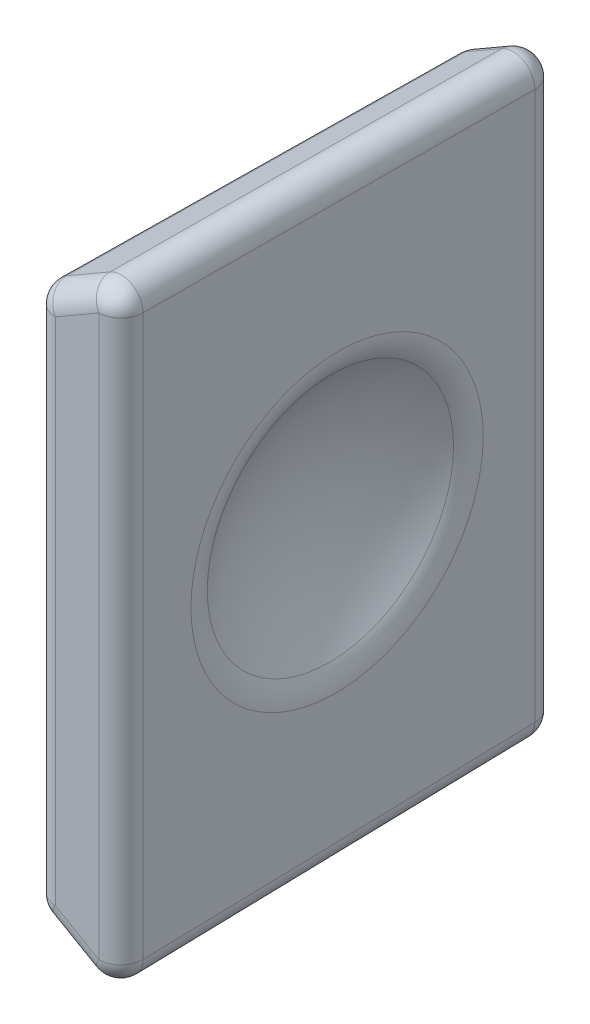
ISO-10303-21;
HEADER;
FILE_DESCRIPTION(('STEP AP214'),'2;1');
FILE_NAME('part.step','',(''),(''),'','','');
FILE_SCHEMA(('AUTOMOTIVE_DESIGN { 1 0 10303 214 1 1 1 1 }'));
ENDSEC;
DATA;
#1=APPLICATION_CONTEXT('core data for automotive mechanical design processes');
#2=APPLICATION_PROTOCOL_DEFINITION('international standard','automotive_design',2000,#1);
#3=PRODUCT_CONTEXT('',#1,'mechanical');
#4=PRODUCT('Part','Part','',(#3));
#5=PRODUCT_RELATED_PRODUCT_CATEGORY('part','',(#4));
#6=PRODUCT_DEFINITION_FORMATION('','',#4);
#7=PRODUCT_DEFINITION_CONTEXT('part definition',#1,'design');
#8=PRODUCT_DEFINITION('design','',#6,#7);
#9=PRODUCT_DEFINITION_SHAPE('','',#8);
#10=(LENGTH_UNIT() NAMED_UNIT(*) SI_UNIT(.MILLI.,.METRE.));
#11=(NAMED_UNIT(*) PLANE_ANGLE_UNIT() SI_UNIT($,.RADIAN.));
#12=(NAMED_UNIT(*) SI_UNIT($,.STERADIAN.) SOLID_ANGLE_UNIT());
#13=UNCERTAINTY_MEASURE_WITH_UNIT(LENGTH_MEASURE(1.E-05),#10,'distance_accuracy_value','');
#14=(GEOMETRIC_REPRESENTATION_CONTEXT(3) GLOBAL_UNCERTAINTY_ASSIGNED_CONTEXT((#13)) GLOBAL_UNIT_ASSIGNED_CONTEXT((#10,
#11,#12)) REPRESENTATION_CONTEXT('',''));
#15=CARTESIAN_POINT('',(0.,0.,0.));
#16=DIRECTION('',(0.,0.,1.));
#17=DIRECTION('',(1.,0.,0.));
#18=AXIS2_PLACEMENT_3D('',#15,#16,#17);
#19=CARTESIAN_POINT('',(0.,0.,0.));
#20=DIRECTION('',(0.999961923064171,0.,-0.00872653549837395));
#21=DIRECTION('',(-0.00872653549837395,0.,-0.999961923064171));
#22=AXIS2_PLACEMENT_3D('',#19,#20,#21);
#23=PLANE('',#22);
#24=CARTESIAN_POINT('',(-0.0866037831003816,0.,-9.92381060156461));
#25=DIRECTION('',(0.999961923064171,0.,-0.00872653549837395));
#26=DIRECTION('',(-0.00872653549837395,0.,-0.999961923064171));
#27=AXIS2_PLACEMENT_3D('',#24,#25,#26);
#28=CIRCLE('',#27,6.71078287266393);
#29=CARTESIAN_POINT('',(-0.145165668060563,0.,-16.6343379481797));
#30=VERTEX_POINT('',#29);
#31=EDGE_CURVE('E11',#30,#30,#28,.F.);
#32=ORIENTED_EDGE('',*,*,#31,.T.);
#33=EDGE_LOOP('',(#32));
#34=FACE_BOUND('',#33,.T.);
#35=DIRECTION('',(-0.00872553884892132,0.0151130766097479,-0.999847718348741));
#36=VECTOR('',#35,1.);
#37=CARTESIAN_POINT('',(-0.00168371480008397,-12.7650988640394,-0.192934606144742));
#38=LINE('',#37,#36);
#39=CARTESIAN_POINT('',(-0.00880302311232116,-12.7527678603278,-1.00872653549837));
#40=VERTEX_POINT('',#39);
#41=CARTESIAN_POINT('',(-0.16588664334598,-12.4806910490463,-19.0087265354984));
#42=VERTEX_POINT('',#41);
#43=EDGE_CURVE('E184',#40,#42,#38,.T.);
#44=ORIENTED_EDGE('',*,*,#43,.T.);
#45=DIRECTION('',(0.,-1.,0.));
#46=VECTOR('',#45,1.);
#47=CARTESIAN_POINT('',(-0.16588664334598,0.,-19.0087265354984));
#48=LINE('',#47,#46);
#49=CARTESIAN_POINT('',(-0.16588664334598,12.4806910490463,-19.0087265354984));
#50=VERTEX_POINT('',#49);
#51=EDGE_CURVE('E189',#42,#50,#48,.F.);
#52=ORIENTED_EDGE('',*,*,#51,.T.);
#53=DIRECTION('',(-0.00872553884892131,-0.0151130766097478,-0.999847718348741));
#54=VECTOR('',#53,1.);
#55=CARTESIAN_POINT('',(-0.00168371480008396,12.7650988640394,-0.192934606144741));
#56=LINE('',#55,#54);
#57=CARTESIAN_POINT('',(-0.00880302311232116,12.7527678603278,-1.00872653549837));
#58=VERTEX_POINT('',#57);
#59=EDGE_CURVE('E186',#50,#58,#56,.F.);
#60=ORIENTED_EDGE('',*,*,#59,.T.);
#61=DIRECTION('',(0.,-1.,0.));
#62=VECTOR('',#61,1.);
#63=CARTESIAN_POINT('',(-0.00880302311232116,-14.5,-1.00872653549837));
#64=LINE('',#63,#62);
#65=EDGE_CURVE('E182',#58,#40,#64,.T.);
#66=ORIENTED_EDGE('',*,*,#65,.T.);
#67=EDGE_LOOP('',(#44,#52,#60,#66));
#68=FACE_BOUND('',#67,.T.);
#69=ADVANCED_FACE('F34',(#34,#68),#23,.T.);
#70=CARTESIAN_POINT('',(-6.27868417743721,-10.8749999999999,0.));
#71=DIRECTION('',(-0.49998096153209,-0.86599242819071,-0.00872653549837395));
#72=DIRECTION('',(0.866025403784436,-0.500000000000004,0.));
#73=AXIS2_PLACEMENT_3D('',#70,#71,#72);
#74=PLANE('',#73);
#75=DIRECTION('',(-0.0087264247426805,-0.00503820367424957,0.999949231718764));
#76=VECTOR('',#75,1.);
#77=CARTESIAN_POINT('',(-3.32550706518248,-12.3785085312186,-19.9970914501805));
#78=LINE('',#77,#76);
#79=CARTESIAN_POINT('',(-3.49121601535559,-12.4741806382081,-1.00872653549837));
#80=VERTEX_POINT('',#79);
#81=CARTESIAN_POINT('',(-3.33413239512193,-12.3834883677809,-19.0087265354984));
#82=VERTEX_POINT('',#81);
#83=EDGE_CURVE('E204',#80,#82,#78,.F.);
#84=ORIENTED_EDGE('',*,*,#83,.T.);
#85=DIRECTION('',(-0.866025403784436,0.500000000000004,0.));
#86=VECTOR('',#85,1.);
#87=CARTESIAN_POINT('',(-6.19574085576422,-10.7313379527138,-19.0087265354984));
#88=LINE('',#87,#86);
#89=CARTESIAN_POINT('',(-1.66582952794224,-13.346683477237,-19.0087265354984));
#90=VERTEX_POINT('',#89);
#91=EDGE_CURVE('E57',#82,#90,#88,.F.);
#92=ORIENTED_EDGE('',*,*,#91,.T.);
#93=DIRECTION('',(-0.00872553884892131,0.0151130766097479,-0.999847718348741));
#94=VECTOR('',#93,1.);
#95=CARTESIAN_POINT('',(-1.50067054380248,-13.6327472290935,-0.0833814861949687));
#96=LINE('',#95,#94);
#97=CARTESIAN_POINT('',(-1.50874590770858,-13.6187602885185,-1.00872653549837));
#98=VERTEX_POINT('',#97);
#99=EDGE_CURVE('E202',#90,#98,#96,.F.);
#100=ORIENTED_EDGE('',*,*,#99,.T.);
#101=DIRECTION('',(-0.866025403784436,0.500000000000004,0.));
#102=VECTOR('',#101,1.);
#103=CARTESIAN_POINT('',(-3.99559848844384,-12.1829752815961,-1.00872653549837));
#104=LINE('',#103,#102);
#105=EDGE_CURVE('E200',#98,#80,#104,.T.);
#106=ORIENTED_EDGE('',*,*,#105,.T.);
#107=EDGE_LOOP('',(#84,#92,#100,#106));
#108=FACE_BOUND('',#107,.T.);
#109=ADVANCED_FACE('F272',(#108),#74,.T.);
#110=CARTESIAN_POINT('',(-4.,0.,0.));
#111=DIRECTION('',(-0.999961923064171,0.,-0.00872653549837395));
#112=DIRECTION('',(-0.00872653549837395,0.,0.999961923064171));
#113=AXIS2_PLACEMENT_3D('',#110,#111,#112);
#114=PLANE('',#113);
#115=DIRECTION('',(0.0087264247426805,-0.00503820367424959,-0.999949231718764));
#116=VECTOR('',#115,1.);
#117=CARTESIAN_POINT('',(-3.82548802671456,11.5125161030279,-19.9970914501805));
#118=LINE('',#117,#116);
#119=CARTESIAN_POINT('',(-3.99119697688768,11.6081882100174,-1.00872653549837));
#120=VERTEX_POINT('',#119);
#121=CARTESIAN_POINT('',(-3.83411335665402,11.5174959395903,-19.0087265354984));
#122=VERTEX_POINT('',#121);
#123=EDGE_CURVE('E133',#120,#122,#118,.T.);
#124=ORIENTED_EDGE('',*,*,#123,.T.);
#125=DIRECTION('',(0.,-1.,0.));
#126=VECTOR('',#125,1.);
#127=CARTESIAN_POINT('',(-3.83411335665401,-12.0898297338779,-19.0087265354984));
#128=LINE('',#127,#126);
#129=CARTESIAN_POINT('',(-3.83411335665401,-11.5174959395902,-19.0087265354984));
#130=VERTEX_POINT('',#129);
#131=EDGE_CURVE('E171',#122,#130,#128,.T.);
#132=ORIENTED_EDGE('',*,*,#131,.T.);
#133=DIRECTION('',(0.0087264247426805,0.00503820367424957,-0.999949231718764));
#134=VECTOR('',#133,1.);
#135=CARTESIAN_POINT('',(-4.00002538252973,-11.6132852923914,0.00290854981948299));
#136=LINE('',#135,#134);
#137=CARTESIAN_POINT('',(-3.99119697688767,-11.6081882100174,-1.00872653549837));
#138=VERTEX_POINT('',#137);
#139=EDGE_CURVE('E164',#130,#138,#136,.F.);
#140=ORIENTED_EDGE('',*,*,#139,.T.);
#141=DIRECTION('',(0.,-1.,0.));
#142=VECTOR('',#141,1.);
#143=CARTESIAN_POINT('',(-3.99119697688767,0.,-1.00872653549837));
#144=LINE('',#143,#142);
#145=EDGE_CURVE('E162',#138,#120,#144,.F.);
#146=ORIENTED_EDGE('',*,*,#145,.T.);
#147=EDGE_LOOP('',(#124,#132,#140,#146));
#148=FACE_BOUND('',#147,.T.);
#149=ADVANCED_FACE('F278',(#148),#114,.T.);
#150=CARTESIAN_POINT('',(-6.27868417743719,10.875,0.));
#151=DIRECTION('',(-0.499980961532087,0.865992428190712,-0.00872653549837395));
#152=DIRECTION('',(-0.866025403784438,-0.500000000000001,0.));
#153=AXIS2_PLACEMENT_3D('',#150,#151,#152);
#154=PLANE('',#153);
#155=DIRECTION('',(0.866025403784438,0.500000000000001,0.));
#156=VECTOR('',#155,1.);
#157=CARTESIAN_POINT('',(-6.1957408557642,10.7313379527138,-19.0087265354984));
#158=LINE('',#157,#156);
#159=CARTESIAN_POINT('',(-1.66582952794224,13.346683477237,-19.0087265354984));
#160=VERTEX_POINT('',#159);
#161=CARTESIAN_POINT('',(-3.33413239512193,12.383488367781,-19.0087265354984));
#162=VERTEX_POINT('',#161);
#163=EDGE_CURVE('E160',#160,#162,#158,.F.);
#164=ORIENTED_EDGE('',*,*,#163,.T.);
#165=DIRECTION('',(-0.0087264247426805,0.00503820367424959,0.999949231718764));
#166=VECTOR('',#165,1.);
#167=CARTESIAN_POINT('',(-3.50004442099765,12.4792777205821,0.00290854981948303));
#168=LINE('',#167,#166);
#169=CARTESIAN_POINT('',(-3.49121601535559,12.4741806382081,-1.00872653549837));
#170=VERTEX_POINT('',#169);
#171=EDGE_CURVE('E131',#162,#170,#168,.T.);
#172=ORIENTED_EDGE('',*,*,#171,.T.);
#173=DIRECTION('',(0.866025403784438,0.500000000000001,0.));
#174=VECTOR('',#173,1.);
#175=CARTESIAN_POINT('',(0.00440151155616648,14.4923763583546,-1.00872653549837));
#176=LINE('',#175,#174);
#177=CARTESIAN_POINT('',(-1.50874590770858,13.6187602885185,-1.00872653549837));
#178=VERTEX_POINT('',#177);
#179=EDGE_CURVE('E149',#170,#178,#176,.T.);
#180=ORIENTED_EDGE('',*,*,#179,.T.);
#181=DIRECTION('',(-0.00872553884892131,-0.0151130766097478,-0.999847718348741));
#182=VECTOR('',#181,1.);
#183=CARTESIAN_POINT('',(-1.50067054380247,13.6327472290935,-0.0833814861949678));
#184=LINE('',#183,#182);
#185=EDGE_CURVE('E155',#178,#160,#184,.T.);
#186=ORIENTED_EDGE('',*,*,#185,.T.);
#187=EDGE_LOOP('',(#164,#172,#180,#186));
#188=FACE_BOUND('',#187,.T.);
#189=ADVANCED_FACE('F158',(#188),#154,.T.);
#190=CARTESIAN_POINT('',(0.,0.,-20.));
#191=DIRECTION('',(0.,0.,1.));
#192=DIRECTION('',(1.,0.,0.));
#193=AXIS2_PLACEMENT_3D('',#190,#191,#192);
#194=PLANE('',#193);
#195=DIRECTION('',(0.,-1.,0.));
#196=VECTOR('',#195,1.);
#197=CARTESIAN_POINT('',(-2.83415143358985,12.089829733878,-20.));
#198=LINE('',#197,#196);
#199=CARTESIAN_POINT('',(-2.83415143358984,-11.5174959395902,-20.));
#200=VERTEX_POINT('',#199);
#201=CARTESIAN_POINT('',(-2.83415143358985,11.5174959395903,-20.));
#202=VERTEX_POINT('',#201);
#203=EDGE_CURVE('E177',#200,#202,#198,.F.);
#204=ORIENTED_EDGE('',*,*,#203,.T.);
#205=DIRECTION('',(-0.866025403784438,-0.500000000000001,0.));
#206=VECTOR('',#205,1.);
#207=CARTESIAN_POINT('',(-5.69575989423211,9.86534552452313,-20.));
#208=LINE('',#207,#206);
#209=CARTESIAN_POINT('',(-1.16584856641015,12.4806910490463,-20.));
#210=VERTEX_POINT('',#209);
#211=EDGE_CURVE('E179',#202,#210,#208,.F.);
#212=ORIENTED_EDGE('',*,*,#211,.T.);
#213=DIRECTION('',(0.,1.,0.));
#214=VECTOR('',#213,1.);
#215=CARTESIAN_POINT('',(-1.16584856641015,0.,-20.));
#216=LINE('',#215,#214);
#217=CARTESIAN_POINT('',(-1.16584856641015,-12.4806910490463,-20.));
#218=VERTEX_POINT('',#217);
#219=EDGE_CURVE('E175',#210,#218,#216,.F.);
#220=ORIENTED_EDGE('',*,*,#219,.T.);
#221=DIRECTION('',(0.866025403784436,-0.500000000000004,0.));
#222=VECTOR('',#221,1.);
#223=CARTESIAN_POINT('',(-5.69575989423213,-9.86534552452308,-20.));
#224=LINE('',#223,#222);
#225=EDGE_CURVE('E173',#218,#200,#224,.F.);
#226=ORIENTED_EDGE('',*,*,#225,.T.);
#227=EDGE_LOOP('',(#204,#212,#220,#226));
#228=FACE_BOUND('',#227,.T.);
#229=ADVANCED_FACE('F285',(#228),#194,.F.);
#230=CARTESIAN_POINT('',(0.,0.,0.));
#231=DIRECTION('',(0.,0.,1.));
#232=DIRECTION('',(1.,0.,0.));
#233=AXIS2_PLACEMENT_3D('',#230,#231,#232);
#234=PLANE('',#233);
#235=DIRECTION('',(0.,1.,0.));
#236=VECTOR('',#235,1.);
#237=CARTESIAN_POINT('',(-1.00876494617649,14.5,0.));
#238=LINE('',#237,#236);
#239=CARTESIAN_POINT('',(-1.00876494617649,-12.7527678603278,0.));
#240=VERTEX_POINT('',#239);
#241=CARTESIAN_POINT('',(-1.00876494617649,12.7527678603278,0.));
#242=VERTEX_POINT('',#241);
#243=EDGE_CURVE('E193',#240,#242,#238,.T.);
#244=ORIENTED_EDGE('',*,*,#243,.T.);
#245=DIRECTION('',(-0.866025403784438,-0.500000000000001,0.));
#246=VECTOR('',#245,1.);
#247=CARTESIAN_POINT('',(-3.49561752691175,11.3169828534054,0.));
#248=LINE('',#247,#246);
#249=CARTESIAN_POINT('',(-2.9912350538235,11.6081882100174,0.));
#250=VERTEX_POINT('',#249);
#251=EDGE_CURVE('E197',#242,#250,#248,.T.);
#252=ORIENTED_EDGE('',*,*,#251,.T.);
#253=DIRECTION('',(0.,-1.,0.));
#254=VECTOR('',#253,1.);
#255=CARTESIAN_POINT('',(-2.9912350538235,0.,0.));
#256=LINE('',#255,#254);
#257=CARTESIAN_POINT('',(-2.9912350538235,-11.6081882100174,0.));
#258=VERTEX_POINT('',#257);
#259=EDGE_CURVE('E195',#250,#258,#256,.T.);
#260=ORIENTED_EDGE('',*,*,#259,.T.);
#261=DIRECTION('',(0.866025403784436,-0.500000000000004,0.));
#262=VECTOR('',#261,1.);
#263=CARTESIAN_POINT('',(0.504382473088254,-13.6263839301639,0.));
#264=LINE('',#263,#262);
#265=EDGE_CURVE('E191',#258,#240,#264,.T.);
#266=ORIENTED_EDGE('',*,*,#265,.T.);
#267=EDGE_LOOP('',(#244,#252,#260,#266));
#268=FACE_BOUND('',#267,.T.);
#269=ADVANCED_FACE('F359',(#268),#234,.T.);
#270=CARTESIAN_POINT('',(-1.00068958227039,-12.7667548009028,-0.0746549506965947));
#271=DIRECTION('',(0.00872553884892131,-0.0151130766097479,0.999847718348741));
#272=DIRECTION('',(0.,-0.99988578223937,-0.0151136519598583));
#273=AXIS2_PLACEMENT_3D('',#270,#271,#272);
#274=CYLINDRICAL_SURFACE('',#273,1.);
#275=CARTESIAN_POINT('',(-1.16584856641015,-12.4806910490463,-19.));
#276=DIRECTION('',(-0.00872553884892274,0.0151130766097504,-0.999847718348741));
#277=DIRECTION('',(0.,0.99988578223937,0.0151136519598608));
#278=AXIS2_PLACEMENT_3D('',#275,#276,#277);
#279=CIRCLE('',#278,1.);
#280=EDGE_CURVE('E156',#42,#90,#279,.T.);
#281=ORIENTED_EDGE('',*,*,#280,.F.);
#282=ORIENTED_EDGE('',*,*,#43,.F.);
#283=CARTESIAN_POINT('',(-1.00876494617649,-12.7527678603278,-1.));
#284=DIRECTION('',(0.00872553884892122,-0.0151130766097477,0.999847718348741));
#285=DIRECTION('',(0.,-0.99988578223937,-0.0151136519598581));
#286=AXIS2_PLACEMENT_3D('',#283,#284,#285);
#287=CIRCLE('',#286,1.);
#288=EDGE_CURVE('E255',#98,#40,#287,.T.);
#289=ORIENTED_EDGE('',*,*,#288,.F.);
#290=ORIENTED_EDGE('',*,*,#99,.F.);
#291=EDGE_LOOP('',(#281,#282,#289,#290));
#292=FACE_BOUND('',#291,.T.);
#293=ADVANCED_FACE('F356',(#292),#274,.T.);
#294=CARTESIAN_POINT('',(-1.16584856641015,-12.4806910490463,-19.));
#295=DIRECTION('',(0.,0.,1.));
#296=DIRECTION('',(1.,0.,0.));
#297=AXIS2_PLACEMENT_3D('',#294,#295,#296);
#298=SPHERICAL_SURFACE('',#297,1.);
#299=CARTESIAN_POINT('',(-1.16584856641015,-12.4806910490463,-19.));
#300=DIRECTION('',(0.,-1.,0.));
#301=DIRECTION('',(1.,0.,0.));
#302=AXIS2_PLACEMENT_3D('',#299,#300,#301);
#303=CIRCLE('',#302,1.);
#304=EDGE_CURVE('E249',#42,#218,#303,.F.);
#305=ORIENTED_EDGE('',*,*,#304,.F.);
#306=ORIENTED_EDGE('',*,*,#280,.T.);
#307=CARTESIAN_POINT('',(-1.16584856641015,-12.4806910490463,-19.));
#308=DIRECTION('',(0.866025403784436,-0.500000000000004,0.));
#309=DIRECTION('',(0.500000000000004,0.866025403784436,0.));
#310=AXIS2_PLACEMENT_3D('',#307,#308,#309);
#311=CIRCLE('',#310,1.);
#312=EDGE_CURVE('E252',#218,#90,#311,.F.);
#313=ORIENTED_EDGE('',*,*,#312,.F.);
#314=EDGE_LOOP('',(#305,#306,#313));
#315=FACE_BOUND('',#314,.T.);
#316=ADVANCED_FACE('F353',(#315),#298,.T.);
#317=CARTESIAN_POINT('',(-1.00876494617649,-12.7527678603278,-1.));
#318=DIRECTION('',(0.,0.,1.));
#319=DIRECTION('',(1.,0.,0.));
#320=AXIS2_PLACEMENT_3D('',#317,#318,#319);
#321=SPHERICAL_SURFACE('',#320,1.);
#322=CARTESIAN_POINT('',(-1.00876494617649,-12.7527678603278,-1.));
#323=DIRECTION('',(0.866025403784436,-0.500000000000004,0.));
#324=DIRECTION('',(0.500000000000004,0.866025403784436,0.));
#325=AXIS2_PLACEMENT_3D('',#322,#323,#324);
#326=CIRCLE('',#325,1.);
#327=EDGE_CURVE('E243',#98,#240,#326,.F.);
#328=ORIENTED_EDGE('',*,*,#327,.F.);
#329=ORIENTED_EDGE('',*,*,#288,.T.);
#330=CARTESIAN_POINT('',(-1.00876494617649,-12.7527678603278,-1.));
#331=DIRECTION('',(0.,-1.,0.));
#332=DIRECTION('',(0.,0.,-1.));
#333=AXIS2_PLACEMENT_3D('',#330,#331,#332);
#334=CIRCLE('',#333,1.);
#335=EDGE_CURVE('E246',#240,#40,#334,.F.);
#336=ORIENTED_EDGE('',*,*,#335,.F.);
#337=EDGE_LOOP('',(#328,#329,#336));
#338=FACE_BOUND('',#337,.T.);
#339=ADVANCED_FACE('F349',(#338),#321,.T.);
#340=CARTESIAN_POINT('',(-5.69575989423213,-9.86534552452308,-19.));
#341=DIRECTION('',(0.866025403784436,-0.500000000000004,0.));
#342=DIRECTION('',(0.500000000000004,0.866025403784436,0.));
#343=AXIS2_PLACEMENT_3D('',#340,#341,#342);
#344=CYLINDRICAL_SURFACE('',#343,1.);
#345=ORIENTED_EDGE('',*,*,#312,.T.);
#346=ORIENTED_EDGE('',*,*,#91,.F.);
#347=CARTESIAN_POINT('',(-2.83415143358984,-11.5174959395902,-19.));
#348=DIRECTION('',(-0.866025403784436,0.500000000000004,0.));
#349=DIRECTION('',(-0.500000000000004,-0.866025403784436,0.));
#350=AXIS2_PLACEMENT_3D('',#347,#348,#349);
#351=CIRCLE('',#350,1.);
#352=EDGE_CURVE('E49',#200,#82,#351,.T.);
#353=ORIENTED_EDGE('',*,*,#352,.F.);
#354=ORIENTED_EDGE('',*,*,#225,.F.);
#355=EDGE_LOOP('',(#345,#346,#353,#354));
#356=FACE_BOUND('',#355,.T.);
#357=ADVANCED_FACE('F345',(#356),#344,.T.);
#358=CARTESIAN_POINT('',(-1.16584856641015,0.,-19.));
#359=DIRECTION('',(0.,1.,0.));
#360=DIRECTION('',(0.,0.,1.));
#361=AXIS2_PLACEMENT_3D('',#358,#359,#360);
#362=CYLINDRICAL_SURFACE('',#361,1.);
#363=ORIENTED_EDGE('',*,*,#304,.T.);
#364=ORIENTED_EDGE('',*,*,#219,.F.);
#365=CARTESIAN_POINT('',(-1.16584856641015,12.4806910490463,-19.));
#366=DIRECTION('',(0.,1.,0.));
#367=DIRECTION('',(0.,0.,1.));
#368=AXIS2_PLACEMENT_3D('',#365,#366,#367);
#369=CIRCLE('',#368,1.);
#370=EDGE_CURVE('E237',#50,#210,#369,.T.);
#371=ORIENTED_EDGE('',*,*,#370,.F.);
#372=ORIENTED_EDGE('',*,*,#51,.F.);
#373=EDGE_LOOP('',(#363,#364,#371,#372));
#374=FACE_BOUND('',#373,.T.);
#375=ADVANCED_FACE('F341',(#374),#362,.T.);
#376=CARTESIAN_POINT('',(-1.00164563786426,12.7650988640394,-0.184208070646368));
#377=DIRECTION('',(0.00872553884892131,0.0151130766097478,0.999847718348741));
#378=DIRECTION('',(0.,-0.99988578223937,0.0151136519598582));
#379=AXIS2_PLACEMENT_3D('',#376,#377,#378);
#380=CYLINDRICAL_SURFACE('',#379,1.);
#381=CARTESIAN_POINT('',(-1.00876494617649,12.7527678603278,-1.));
#382=DIRECTION('',(0.00872553884892122,0.0151130766097476,0.999847718348741));
#383=DIRECTION('',(0.,-0.99988578223937,0.015113651959858));
#384=AXIS2_PLACEMENT_3D('',#381,#382,#383);
#385=CIRCLE('',#384,1.);
#386=EDGE_CURVE('E231',#58,#178,#385,.T.);
#387=ORIENTED_EDGE('',*,*,#386,.F.);
#388=ORIENTED_EDGE('',*,*,#59,.F.);
#389=CARTESIAN_POINT('',(-1.16584856641015,12.4806910490463,-19.));
#390=DIRECTION('',(-0.00872553884892273,-0.0151130766097503,-0.999847718348741));
#391=DIRECTION('',(0.,0.99988578223937,-0.0151136519598607));
#392=AXIS2_PLACEMENT_3D('',#389,#390,#391);
#393=CIRCLE('',#392,1.);
#394=EDGE_CURVE('E234',#160,#50,#393,.T.);
#395=ORIENTED_EDGE('',*,*,#394,.F.);
#396=ORIENTED_EDGE('',*,*,#185,.F.);
#397=EDGE_LOOP('',(#387,#388,#395,#396));
#398=FACE_BOUND('',#397,.T.);
#399=ADVANCED_FACE('F337',(#398),#380,.T.);
#400=CARTESIAN_POINT('',(-1.00876494617649,0.,-1.));
#401=DIRECTION('',(0.,-1.,0.));
#402=DIRECTION('',(0.,0.,-1.));
#403=AXIS2_PLACEMENT_3D('',#400,#401,#402);
#404=CYLINDRICAL_SURFACE('',#403,1.);
#405=ORIENTED_EDGE('',*,*,#335,.T.);
#406=ORIENTED_EDGE('',*,*,#65,.F.);
#407=CARTESIAN_POINT('',(-1.00876494617649,12.7527678603278,-1.));
#408=DIRECTION('',(0.,1.,0.));
#409=DIRECTION('',(-1.,0.,0.));
#410=AXIS2_PLACEMENT_3D('',#407,#408,#409);
#411=CIRCLE('',#410,1.);
#412=EDGE_CURVE('E229',#242,#58,#411,.T.);
#413=ORIENTED_EDGE('',*,*,#412,.F.);
#414=ORIENTED_EDGE('',*,*,#243,.F.);
#415=EDGE_LOOP('',(#405,#406,#413,#414));
#416=FACE_BOUND('',#415,.T.);
#417=ADVANCED_FACE('F333',(#416),#404,.T.);
#418=CARTESIAN_POINT('',(-5.77430170434896,-10.0013839301639,-1.));
#419=DIRECTION('',(-0.866025403784436,0.500000000000004,0.));
#420=DIRECTION('',(-0.500000000000004,-0.866025403784436,0.));
#421=AXIS2_PLACEMENT_3D('',#418,#419,#420);
#422=CYLINDRICAL_SURFACE('',#421,1.);
#423=ORIENTED_EDGE('',*,*,#327,.T.);
#424=ORIENTED_EDGE('',*,*,#265,.F.);
#425=CARTESIAN_POINT('',(-2.9912350538235,-11.6081882100174,-1.));
#426=DIRECTION('',(-0.866025403784436,0.500000000000004,0.));
#427=DIRECTION('',(-0.500000000000004,-0.866025403784436,0.));
#428=AXIS2_PLACEMENT_3D('',#425,#426,#427);
#429=CIRCLE('',#428,1.);
#430=EDGE_CURVE('E226',#80,#258,#429,.T.);
#431=ORIENTED_EDGE('',*,*,#430,.F.);
#432=ORIENTED_EDGE('',*,*,#105,.F.);
#433=EDGE_LOOP('',(#423,#424,#431,#432));
#434=FACE_BOUND('',#433,.T.);
#435=ADVANCED_FACE('F329',(#434),#422,.T.);
#436=CARTESIAN_POINT('',(-2.99952749362519,-11.6129758523692,-0.0497805168456565));
#437=DIRECTION('',(-0.0087264247426805,-0.00503820367424957,0.999949231718764));
#438=DIRECTION('',(0.999961923064171,0.,0.00872653549837395));
#439=AXIS2_PLACEMENT_3D('',#436,#437,#438);
#440=CYLINDRICAL_SURFACE('',#439,1.);
#441=CARTESIAN_POINT('',(-2.83415143358984,-11.5174959395902,-19.));
#442=DIRECTION('',(0.00872642474268192,0.00503820367425039,-0.999949231718764));
#443=DIRECTION('',(-0.999961923064171,0.,-0.00872653549837538));
#444=AXIS2_PLACEMENT_3D('',#441,#442,#443);
#445=CIRCLE('',#444,1.);
#446=EDGE_CURVE('E241',#82,#130,#445,.T.);
#447=ORIENTED_EDGE('',*,*,#446,.F.);
#448=ORIENTED_EDGE('',*,*,#83,.F.);
#449=CARTESIAN_POINT('',(-2.9912350538235,-11.6081882100174,-1.));
#450=DIRECTION('',(-0.0087264247426804,-0.00503820367424952,0.999949231718764));
#451=DIRECTION('',(0.999961923064171,0.,0.00872653549837386));
#452=AXIS2_PLACEMENT_3D('',#449,#450,#451);
#453=CIRCLE('',#452,1.);
#454=EDGE_CURVE('E223',#138,#80,#453,.T.);
#455=ORIENTED_EDGE('',*,*,#454,.F.);
#456=ORIENTED_EDGE('',*,*,#139,.F.);
#457=EDGE_LOOP('',(#447,#448,#455,#456));
#458=FACE_BOUND('',#457,.T.);
#459=ADVANCED_FACE('F326',(#458),#440,.T.);
#460=CARTESIAN_POINT('',(-2.83415143358984,-11.5174959395902,-19.));
#461=DIRECTION('',(0.,0.,1.));
#462=DIRECTION('',(1.,0.,0.));
#463=AXIS2_PLACEMENT_3D('',#460,#461,#462);
#464=SPHERICAL_SURFACE('',#463,1.);
#465=ORIENTED_EDGE('',*,*,#352,.T.);
#466=ORIENTED_EDGE('',*,*,#446,.T.);
#467=CARTESIAN_POINT('',(-2.83415143358984,-11.5174959395902,-19.));
#468=DIRECTION('',(0.,-1.,0.));
#469=DIRECTION('',(0.,0.,-1.));
#470=AXIS2_PLACEMENT_3D('',#467,#468,#469);
#471=CIRCLE('',#470,1.);
#472=EDGE_CURVE('E220',#200,#130,#471,.F.);
#473=ORIENTED_EDGE('',*,*,#472,.F.);
#474=EDGE_LOOP('',(#465,#466,#473));
#475=FACE_BOUND('',#474,.T.);
#476=ADVANCED_FACE('F322',(#475),#464,.T.);
#477=CARTESIAN_POINT('',(-1.16584856641015,12.4806910490463,-19.));
#478=DIRECTION('',(0.,0.,1.));
#479=DIRECTION('',(1.,0.,0.));
#480=AXIS2_PLACEMENT_3D('',#477,#478,#479);
#481=SPHERICAL_SURFACE('',#480,1.);
#482=ORIENTED_EDGE('',*,*,#394,.T.);
#483=ORIENTED_EDGE('',*,*,#370,.T.);
#484=CARTESIAN_POINT('',(-1.16584856641015,12.4806910490463,-19.));
#485=DIRECTION('',(0.866025403784437,0.500000000000003,0.));
#486=DIRECTION('',(-0.500000000000003,0.866025403784437,0.));
#487=AXIS2_PLACEMENT_3D('',#484,#485,#486);
#488=CIRCLE('',#487,1.);
#489=EDGE_CURVE('E218',#160,#210,#488,.F.);
#490=ORIENTED_EDGE('',*,*,#489,.F.);
#491=EDGE_LOOP('',(#482,#483,#490));
#492=FACE_BOUND('',#491,.T.);
#493=ADVANCED_FACE('F318',(#492),#481,.T.);
#494=CARTESIAN_POINT('',(-1.00876494617649,12.7527678603278,-1.));
#495=DIRECTION('',(0.,0.,1.));
#496=DIRECTION('',(1.,0.,0.));
#497=AXIS2_PLACEMENT_3D('',#494,#495,#496);
#498=SPHERICAL_SURFACE('',#497,1.);
#499=ORIENTED_EDGE('',*,*,#412,.T.);
#500=ORIENTED_EDGE('',*,*,#386,.T.);
#501=CARTESIAN_POINT('',(-1.00876494617649,12.7527678603278,-1.));
#502=DIRECTION('',(0.866025403784438,0.500000000000001,0.));
#503=DIRECTION('',(-0.500000000000001,0.866025403784438,0.));
#504=AXIS2_PLACEMENT_3D('',#501,#502,#503);
#505=CIRCLE('',#504,1.);
#506=EDGE_CURVE('E152',#242,#178,#505,.F.);
#507=ORIENTED_EDGE('',*,*,#506,.F.);
#508=EDGE_LOOP('',(#499,#500,#507));
#509=FACE_BOUND('',#508,.T.);
#510=ADVANCED_FACE('F314',(#509),#498,.T.);
#511=CARTESIAN_POINT('',(-2.9912350538235,-11.6081882100174,-1.));
#512=DIRECTION('',(0.,0.,1.));
#513=DIRECTION('',(1.,0.,0.));
#514=AXIS2_PLACEMENT_3D('',#511,#512,#513);
#515=SPHERICAL_SURFACE('',#514,1.);
#516=ORIENTED_EDGE('',*,*,#454,.T.);
#517=ORIENTED_EDGE('',*,*,#430,.T.);
#518=CARTESIAN_POINT('',(-2.9912350538235,-11.6081882100174,-1.));
#519=DIRECTION('',(0.,-1.,0.));
#520=DIRECTION('',(0.,0.,-1.));
#521=AXIS2_PLACEMENT_3D('',#518,#519,#520);
#522=CIRCLE('',#521,1.);
#523=EDGE_CURVE('E214',#138,#258,#522,.F.);
#524=ORIENTED_EDGE('',*,*,#523,.F.);
#525=EDGE_LOOP('',(#516,#517,#524));
#526=FACE_BOUND('',#525,.T.);
#527=ADVANCED_FACE('F310',(#526),#515,.T.);
#528=CARTESIAN_POINT('',(-2.83415143358984,0.,-19.));
#529=DIRECTION('',(0.,1.,0.));
#530=DIRECTION('',(-1.,0.,0.));
#531=AXIS2_PLACEMENT_3D('',#528,#529,#530);
#532=CYLINDRICAL_SURFACE('',#531,1.);
#533=ORIENTED_EDGE('',*,*,#472,.T.);
#534=ORIENTED_EDGE('',*,*,#131,.F.);
#535=CARTESIAN_POINT('',(-2.83415143358985,11.5174959395903,-19.));
#536=DIRECTION('',(0.,1.,0.));
#537=DIRECTION('',(-1.,0.,0.));
#538=AXIS2_PLACEMENT_3D('',#535,#536,#537);
#539=CIRCLE('',#538,1.);
#540=EDGE_CURVE('E211',#202,#122,#539,.T.);
#541=ORIENTED_EDGE('',*,*,#540,.F.);
#542=ORIENTED_EDGE('',*,*,#203,.F.);
#543=EDGE_LOOP('',(#533,#534,#541,#542));
#544=FACE_BOUND('',#543,.T.);
#545=ADVANCED_FACE('F306',(#544),#532,.T.);
#546=CARTESIAN_POINT('',(-5.69575989423211,9.86534552452313,-19.));
#547=DIRECTION('',(-0.866025403784438,-0.500000000000001,0.));
#548=DIRECTION('',(0.500000000000001,-0.866025403784438,0.));
#549=AXIS2_PLACEMENT_3D('',#546,#547,#548);
#550=CYLINDRICAL_SURFACE('',#549,1.);
#551=ORIENTED_EDGE('',*,*,#489,.T.);
#552=ORIENTED_EDGE('',*,*,#211,.F.);
#553=CARTESIAN_POINT('',(-2.83415143358984,11.5174959395903,-19.));
#554=DIRECTION('',(-0.866025403784438,-0.500000000000001,0.));
#555=DIRECTION('',(0.500000000000001,-0.866025403784438,0.));
#556=AXIS2_PLACEMENT_3D('',#553,#554,#555);
#557=CIRCLE('',#556,1.);
#558=EDGE_CURVE('E146',#162,#202,#557,.T.);
#559=ORIENTED_EDGE('',*,*,#558,.F.);
#560=ORIENTED_EDGE('',*,*,#163,.F.);
#561=EDGE_LOOP('',(#551,#552,#559,#560));
#562=FACE_BOUND('',#561,.T.);
#563=ADVANCED_FACE('F303',(#562),#550,.T.);
#564=CARTESIAN_POINT('',(-5.77430170434894,10.0013839301639,-1.));
#565=DIRECTION('',(0.866025403784438,0.500000000000001,0.));
#566=DIRECTION('',(-0.500000000000001,0.866025403784438,0.));
#567=AXIS2_PLACEMENT_3D('',#564,#565,#566);
#568=CYLINDRICAL_SURFACE('',#567,1.);
#569=ORIENTED_EDGE('',*,*,#506,.T.);
#570=ORIENTED_EDGE('',*,*,#179,.F.);
#571=CARTESIAN_POINT('',(-2.9912350538235,11.6081882100174,-1.));
#572=DIRECTION('',(-0.866025403784439,-0.499999999999999,0.));
#573=DIRECTION('',(0.499999999999999,-0.866025403784439,0.));
#574=AXIS2_PLACEMENT_3D('',#571,#572,#573);
#575=CIRCLE('',#574,1.);
#576=EDGE_CURVE('E138',#250,#170,#575,.T.);
#577=ORIENTED_EDGE('',*,*,#576,.F.);
#578=ORIENTED_EDGE('',*,*,#251,.F.);
#579=EDGE_LOOP('',(#569,#570,#577,#578));
#580=FACE_BOUND('',#579,.T.);
#581=ADVANCED_FACE('F150',(#580),#568,.T.);
#582=CARTESIAN_POINT('',(-2.9912350538235,0.,-1.));
#583=DIRECTION('',(0.,-1.,0.));
#584=DIRECTION('',(1.,0.,0.));
#585=AXIS2_PLACEMENT_3D('',#582,#583,#584);
#586=CYLINDRICAL_SURFACE('',#585,1.);
#587=ORIENTED_EDGE('',*,*,#523,.T.);
#588=ORIENTED_EDGE('',*,*,#259,.F.);
#589=CARTESIAN_POINT('',(-2.9912350538235,11.6081882100174,-1.));
#590=DIRECTION('',(0.,1.,0.));
#591=DIRECTION('',(0.,0.,1.));
#592=AXIS2_PLACEMENT_3D('',#589,#590,#591);
#593=CIRCLE('',#592,1.);
#594=EDGE_CURVE('E142',#120,#250,#593,.T.);
#595=ORIENTED_EDGE('',*,*,#594,.F.);
#596=ORIENTED_EDGE('',*,*,#145,.F.);
#597=EDGE_LOOP('',(#587,#588,#595,#596));
#598=FACE_BOUND('',#597,.T.);
#599=ADVANCED_FACE('F296',(#598),#586,.T.);
#600=CARTESIAN_POINT('',(-2.83415143358985,11.5174959395903,-19.));
#601=DIRECTION('',(0.,0.,1.));
#602=DIRECTION('',(1.,0.,0.));
#603=AXIS2_PLACEMENT_3D('',#600,#601,#602);
#604=SPHERICAL_SURFACE('',#603,1.);
#605=ORIENTED_EDGE('',*,*,#558,.T.);
#606=ORIENTED_EDGE('',*,*,#540,.T.);
#607=CARTESIAN_POINT('',(-2.83415143358985,11.5174959395903,-19.));
#608=DIRECTION('',(0.00872642474268192,-0.00503820367425042,-0.999949231718764));
#609=DIRECTION('',(-0.999961923064171,0.,-0.00872653549837538));
#610=AXIS2_PLACEMENT_3D('',#607,#608,#609);
#611=CIRCLE('',#610,1.);
#612=EDGE_CURVE('E135',#162,#122,#611,.F.);
#613=ORIENTED_EDGE('',*,*,#612,.F.);
#614=EDGE_LOOP('',(#605,#606,#613));
#615=FACE_BOUND('',#614,.T.);
#616=ADVANCED_FACE('F293',(#615),#604,.T.);
#617=CARTESIAN_POINT('',(-2.9912350538235,11.6081882100174,-1.));
#618=DIRECTION('',(0.,0.,1.));
#619=DIRECTION('',(1.,0.,0.));
#620=AXIS2_PLACEMENT_3D('',#617,#618,#619);
#621=SPHERICAL_SURFACE('',#620,1.);
#622=ORIENTED_EDGE('',*,*,#594,.T.);
#623=ORIENTED_EDGE('',*,*,#576,.T.);
#624=CARTESIAN_POINT('',(-2.9912350538235,11.6081882100174,-1.));
#625=DIRECTION('',(-0.0087264247426804,0.00503820367424954,0.999949231718764));
#626=DIRECTION('',(0.999961923064171,0.,0.00872653549837386));
#627=AXIS2_PLACEMENT_3D('',#624,#625,#626);
#628=CIRCLE('',#627,1.);
#629=EDGE_CURVE('E127',#120,#170,#628,.F.);
#630=ORIENTED_EDGE('',*,*,#629,.F.);
#631=EDGE_LOOP('',(#622,#623,#630));
#632=FACE_BOUND('',#631,.T.);
#633=ADVANCED_FACE('F140',(#632),#621,.T.);
#634=CARTESIAN_POINT('',(-3.00017914140817,11.6133520813921,0.024890922965424));
#635=DIRECTION('',(-0.0087264247426805,0.00503820367424959,0.999949231718764));
#636=DIRECTION('',(0.999961923064171,0.,0.00872653549837395));
#637=AXIS2_PLACEMENT_3D('',#634,#635,#636);
#638=CYLINDRICAL_SURFACE('',#637,1.);
#639=ORIENTED_EDGE('',*,*,#612,.T.);
#640=ORIENTED_EDGE('',*,*,#123,.F.);
#641=ORIENTED_EDGE('',*,*,#629,.T.);
#642=ORIENTED_EDGE('',*,*,#171,.F.);
#643=EDGE_LOOP('',(#639,#640,#641,#642));
#644=FACE_BOUND('',#643,.T.);
#645=ADVANCED_FACE('F129',(#644),#638,.T.);
#646=CARTESIAN_POINT('',(8.72683345458359,0.,-10.00072430312));
#647=DIRECTION('',(0.,0.,-1.));
#648=DIRECTION('',(1.,0.,0.));
#649=AXIS2_PLACEMENT_3D('',#646,#647,#648);
#650=SPHERICAL_SURFACE('',#649,10.7268334545836);
#651=CARTESIAN_POINT('',(8.72683345458359,0.,-10.00072430312));
#652=DIRECTION('',(0.999961923064171,0.,-0.00872653549837395));
#653=DIRECTION('',(-0.00872653549837395,0.,-0.999961923064171));
#654=AXIS2_PLACEMENT_3D('',#651,#652,#653);
#655=SPHERICAL_SURFACE('',#654,10.7268334545836);
#656=CARTESIAN_POINT('',(-0.387226523042272,0.,-9.92118710665824));
#657=DIRECTION('',(0.999961923064171,0.,-0.00872653549837395));
#658=DIRECTION('',(-0.00872653549837395,0.,-0.999961923064171));
#659=AXIS2_PLACEMENT_3D('',#656,#657,#658);
#660=CIRCLE('',#659,5.65619488004004);
#661=CARTESIAN_POINT('',(-0.436585508448662,0.,-15.5771666161288));
#662=VERTEX_POINT('',#661);
#663=EDGE_CURVE('E42',#662,#662,#660,.T.);
#664=ORIENTED_EDGE('',*,*,#663,.T.);
#665=EDGE_LOOP('',(#664));
#666=FACE_BOUND('',#665,.T.);
#667=ADVANCED_FACE('F262',(#666),#655,.F.);
#668=CARTESIAN_POINT('',(-2.08652762922872,0.,-9.90635753056786));
#669=DIRECTION('',(0.999961923064171,0.,-0.00872653549837395));
#670=DIRECTION('',(-0.00872653549837395,0.,-0.999961923064171));
#671=AXIS2_PLACEMENT_3D('',#668,#669,#670);
#672=TOROIDAL_SURFACE('',#671,6.71078287266393,2.);
#673=ORIENTED_EDGE('',*,*,#31,.F.);
#674=EDGE_LOOP('',(#673));
#675=FACE_BOUND('',#674,.T.);
#676=ORIENTED_EDGE('',*,*,#663,.F.);
#677=EDGE_LOOP('',(#676));
#678=FACE_BOUND('',#677,.T.);
#679=ADVANCED_FACE('F36',(#675,#678),#672,.T.);
#680=CLOSED_SHELL('',(#69,#109,#149,#189,#229,#269,#293,#316,#339,#357,#375,#399,#417,#435,#459,
#476,#493,#510,#527,#545,#563,#581,#599,#616,#633,#645,#667,#679));
#681=MANIFOLD_SOLID_BREP('B2',#680);
#682=ADVANCED_BREP_SHAPE_REPRESENTATION('',(#18,#681),#14);
#683=SHAPE_DEFINITION_REPRESENTATION(#9,#682);
ENDSEC;
END-ISO-10303-21;
